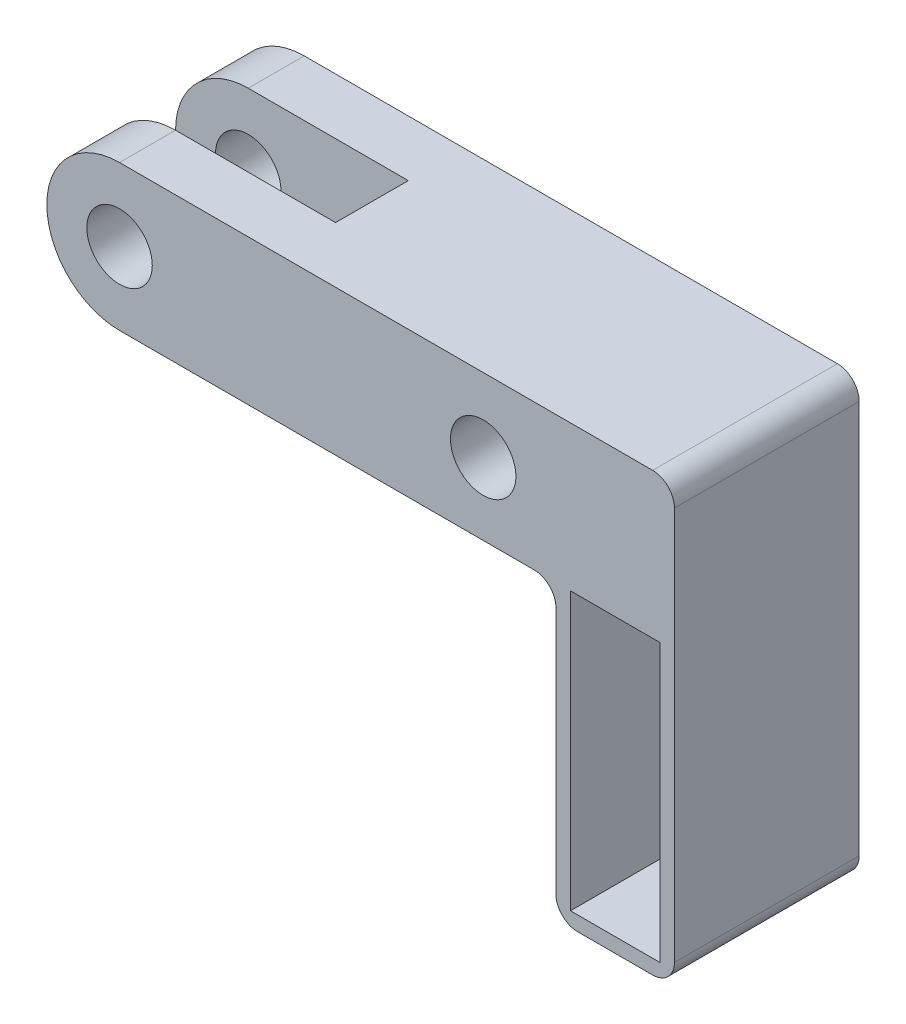
ISO-10303-21;
HEADER;
FILE_DESCRIPTION(('STEP AP214'),'2;1');
FILE_NAME('part.step','',(''),(''),'','','');
FILE_SCHEMA(('AUTOMOTIVE_DESIGN { 1 0 10303 214 1 1 1 1 }'));
ENDSEC;
DATA;
#1=APPLICATION_CONTEXT('core data for automotive mechanical design processes');
#2=APPLICATION_PROTOCOL_DEFINITION('international standard','automotive_design',2000,#1);
#3=PRODUCT_CONTEXT('',#1,'mechanical');
#4=PRODUCT('Part','Part','',(#3));
#5=PRODUCT_RELATED_PRODUCT_CATEGORY('part','',(#4));
#6=PRODUCT_DEFINITION_FORMATION('','',#4);
#7=PRODUCT_DEFINITION_CONTEXT('part definition',#1,'design');
#8=PRODUCT_DEFINITION('design','',#6,#7);
#9=PRODUCT_DEFINITION_SHAPE('','',#8);
#10=(LENGTH_UNIT() NAMED_UNIT(*) SI_UNIT(.MILLI.,.METRE.));
#11=(NAMED_UNIT(*) PLANE_ANGLE_UNIT() SI_UNIT($,.RADIAN.));
#12=(NAMED_UNIT(*) SI_UNIT($,.STERADIAN.) SOLID_ANGLE_UNIT());
#13=UNCERTAINTY_MEASURE_WITH_UNIT(LENGTH_MEASURE(1.E-05),#10,'distance_accuracy_value','');
#14=(GEOMETRIC_REPRESENTATION_CONTEXT(3) GLOBAL_UNCERTAINTY_ASSIGNED_CONTEXT((#13)) GLOBAL_UNIT_ASSIGNED_CONTEXT((#10,
#11,#12)) REPRESENTATION_CONTEXT('',''));
#15=CARTESIAN_POINT('',(0.,0.,0.));
#16=DIRECTION('',(0.,0.,1.));
#17=DIRECTION('',(1.,0.,0.));
#18=AXIS2_PLACEMENT_3D('',#15,#16,#17);
#19=CARTESIAN_POINT('',(0.,0.,6.35));
#20=DIRECTION('',(0.,0.,-1.));
#21=DIRECTION('',(-1.,0.,0.));
#22=AXIS2_PLACEMENT_3D('',#19,#20,#21);
#23=CYLINDRICAL_SURFACE('',#22,5.);
#24=DIRECTION('',(0.,0.,-1.));
#25=VECTOR('',#24,1.);
#26=CARTESIAN_POINT('',(0.,5.,6.35));
#27=LINE('',#26,#25);
#28=CARTESIAN_POINT('',(0.,5.,6.35));
#29=VERTEX_POINT('',#28);
#30=CARTESIAN_POINT('',(0.,5.,2.5));
#31=VERTEX_POINT('',#30);
#32=EDGE_CURVE('E282',#29,#31,#27,.T.);
#33=ORIENTED_EDGE('',*,*,#32,.T.);
#34=CARTESIAN_POINT('',(0.,0.,2.5));
#35=DIRECTION('',(0.,0.,1.));
#36=DIRECTION('',(1.,0.,0.));
#37=AXIS2_PLACEMENT_3D('',#34,#35,#36);
#38=CIRCLE('',#37,5.);
#39=CARTESIAN_POINT('',(0.,-5.,2.5));
#40=VERTEX_POINT('',#39);
#41=EDGE_CURVE('E207',#31,#40,#38,.T.);
#42=ORIENTED_EDGE('',*,*,#41,.T.);
#43=DIRECTION('',(0.,0.,-1.));
#44=VECTOR('',#43,1.);
#45=CARTESIAN_POINT('',(0.,-5.,6.35));
#46=LINE('',#45,#44);
#47=CARTESIAN_POINT('',(0.,-5.,6.35));
#48=VERTEX_POINT('',#47);
#49=EDGE_CURVE('E278',#48,#40,#46,.T.);
#50=ORIENTED_EDGE('',*,*,#49,.F.);
#51=CARTESIAN_POINT('',(0.,0.,6.35));
#52=DIRECTION('',(0.,0.,1.));
#53=DIRECTION('',(1.,0.,0.));
#54=AXIS2_PLACEMENT_3D('',#51,#52,#53);
#55=CIRCLE('',#54,5.);
#56=EDGE_CURVE('E230',#29,#48,#55,.T.);
#57=ORIENTED_EDGE('',*,*,#56,.F.);
#58=EDGE_LOOP('',(#33,#42,#50,#57));
#59=FACE_BOUND('',#58,.T.);
#60=ADVANCED_FACE('F43',(#59),#23,.T.);
#61=CARTESIAN_POINT('',(0.,0.,6.35));
#62=DIRECTION('',(0.,0.,-1.));
#63=DIRECTION('',(-1.,0.,0.));
#64=AXIS2_PLACEMENT_3D('',#61,#62,#63);
#65=CYLINDRICAL_SURFACE('',#64,2.24999999997106);
#66=CARTESIAN_POINT('',(0.,0.,2.5));
#67=DIRECTION('',(0.,0.,1.));
#68=DIRECTION('',(1.,0.,0.));
#69=AXIS2_PLACEMENT_3D('',#66,#67,#68);
#70=CIRCLE('',#69,2.24999999997106);
#71=CARTESIAN_POINT('',(2.24999999997106,0.,2.5));
#72=VERTEX_POINT('',#71);
#73=EDGE_CURVE('E206',#72,#72,#70,.T.);
#74=ORIENTED_EDGE('',*,*,#73,.F.);
#75=EDGE_LOOP('',(#74));
#76=FACE_BOUND('',#75,.T.);
#77=CARTESIAN_POINT('',(0.,0.,6.35));
#78=DIRECTION('',(0.,0.,1.));
#79=DIRECTION('',(1.,0.,0.));
#80=AXIS2_PLACEMENT_3D('',#77,#78,#79);
#81=CIRCLE('',#80,2.24999999997106);
#82=CARTESIAN_POINT('',(2.24999999997106,0.,6.35));
#83=VERTEX_POINT('',#82);
#84=EDGE_CURVE('E213',#83,#83,#81,.T.);
#85=ORIENTED_EDGE('',*,*,#84,.T.);
#86=EDGE_LOOP('',(#85));
#87=FACE_BOUND('',#86,.T.);
#88=ADVANCED_FACE('F371',(#76,#87),#65,.F.);
#89=CARTESIAN_POINT('',(0.,5.,6.35));
#90=DIRECTION('',(0.,1.,0.));
#91=DIRECTION('',(0.,0.,1.));
#92=AXIS2_PLACEMENT_3D('',#89,#90,#91);
#93=PLANE('',#92);
#94=DIRECTION('',(1.,0.,0.));
#95=VECTOR('',#94,1.);
#96=CARTESIAN_POINT('',(0.,5.,6.35));
#97=LINE('',#96,#95);
#98=CARTESIAN_POINT('',(36.65,5.,6.35));
#99=VERTEX_POINT('',#98);
#100=EDGE_CURVE('E228',#29,#99,#97,.T.);
#101=ORIENTED_EDGE('',*,*,#100,.T.);
#102=DIRECTION('',(0.,0.,-1.));
#103=VECTOR('',#102,1.);
#104=CARTESIAN_POINT('',(36.65,5.,6.35));
#105=LINE('',#104,#103);
#106=CARTESIAN_POINT('',(36.65,5.,-6.35));
#107=VERTEX_POINT('',#106);
#108=EDGE_CURVE('E306',#99,#107,#105,.T.);
#109=ORIENTED_EDGE('',*,*,#108,.T.);
#110=DIRECTION('',(1.,0.,0.));
#111=VECTOR('',#110,1.);
#112=CARTESIAN_POINT('',(0.,5.,-6.35));
#113=LINE('',#112,#111);
#114=CARTESIAN_POINT('',(0.,5.,-6.35));
#115=VERTEX_POINT('',#114);
#116=EDGE_CURVE('E261',#115,#107,#113,.T.);
#117=ORIENTED_EDGE('',*,*,#116,.F.);
#118=CARTESIAN_POINT('',(0.,5.,-2.5));
#119=VERTEX_POINT('',#118);
#120=EDGE_CURVE('E190',#119,#115,#27,.T.);
#121=ORIENTED_EDGE('',*,*,#120,.F.);
#122=DIRECTION('',(1.,0.,0.));
#123=VECTOR('',#122,1.);
#124=CARTESIAN_POINT('',(-5.,5.,-2.5));
#125=LINE('',#124,#123);
#126=CARTESIAN_POINT('',(11.,5.,-2.5));
#127=VERTEX_POINT('',#126);
#128=EDGE_CURVE('E172',#119,#127,#125,.T.);
#129=ORIENTED_EDGE('',*,*,#128,.T.);
#130=DIRECTION('',(0.,0.,1.));
#131=VECTOR('',#130,1.);
#132=CARTESIAN_POINT('',(11.,5.,-2.5));
#133=LINE('',#132,#131);
#134=CARTESIAN_POINT('',(11.,5.,2.5));
#135=VERTEX_POINT('',#134);
#136=EDGE_CURVE('E188',#127,#135,#133,.T.);
#137=ORIENTED_EDGE('',*,*,#136,.T.);
#138=DIRECTION('',(-1.,0.,0.));
#139=VECTOR('',#138,1.);
#140=CARTESIAN_POINT('',(-5.,5.,2.5));
#141=LINE('',#140,#139);
#142=EDGE_CURVE('E196',#135,#31,#141,.T.);
#143=ORIENTED_EDGE('',*,*,#142,.T.);
#144=ORIENTED_EDGE('',*,*,#32,.F.);
#145=EDGE_LOOP('',(#101,#109,#117,#121,#129,#137,#143,#144));
#146=FACE_BOUND('',#145,.T.);
#147=ADVANCED_FACE('F186',(#146),#93,.T.);
#148=CARTESIAN_POINT('',(0.,0.,-2.5));
#149=DIRECTION('',(0.,0.,-1.));
#150=DIRECTION('',(-1.,0.,0.));
#151=AXIS2_PLACEMENT_3D('',#148,#149,#150);
#152=CIRCLE('',#151,5.);
#153=CARTESIAN_POINT('',(0.,-5.,-2.5));
#154=VERTEX_POINT('',#153);
#155=EDGE_CURVE('E204',#154,#119,#152,.T.);
#156=ORIENTED_EDGE('',*,*,#155,.T.);
#157=ORIENTED_EDGE('',*,*,#120,.T.);
#158=CARTESIAN_POINT('',(0.,0.,-6.35));
#159=DIRECTION('',(0.,0.,1.));
#160=DIRECTION('',(1.,0.,0.));
#161=AXIS2_PLACEMENT_3D('',#158,#159,#160);
#162=CIRCLE('',#161,5.);
#163=CARTESIAN_POINT('',(0.,-5.,-6.35));
#164=VERTEX_POINT('',#163);
#165=EDGE_CURVE('E264',#115,#164,#162,.T.);
#166=ORIENTED_EDGE('',*,*,#165,.T.);
#167=EDGE_CURVE('E281',#154,#164,#46,.T.);
#168=ORIENTED_EDGE('',*,*,#167,.F.);
#169=EDGE_LOOP('',(#156,#157,#166,#168));
#170=FACE_BOUND('',#169,.T.);
#171=ADVANCED_FACE('F364',(#170),#23,.T.);
#172=CARTESIAN_POINT('',(0.,-5.,6.35));
#173=DIRECTION('',(0.,1.,0.));
#174=DIRECTION('',(0.,0.,1.));
#175=AXIS2_PLACEMENT_3D('',#172,#173,#174);
#176=PLANE('',#175);
#177=DIRECTION('',(1.,0.,0.));
#178=VECTOR('',#177,1.);
#179=CARTESIAN_POINT('',(0.,-5.,-6.35));
#180=LINE('',#179,#178);
#181=CARTESIAN_POINT('',(28.5,-5.,-6.35));
#182=VERTEX_POINT('',#181);
#183=EDGE_CURVE('E267',#164,#182,#180,.T.);
#184=ORIENTED_EDGE('',*,*,#183,.T.);
#185=DIRECTION('',(0.,0.,-1.));
#186=VECTOR('',#185,1.);
#187=CARTESIAN_POINT('',(28.5,-5.,6.35));
#188=LINE('',#187,#186);
#189=CARTESIAN_POINT('',(28.5,-5.,6.35));
#190=VERTEX_POINT('',#189);
#191=EDGE_CURVE('E304',#182,#190,#188,.F.);
#192=ORIENTED_EDGE('',*,*,#191,.T.);
#193=DIRECTION('',(1.,0.,0.));
#194=VECTOR('',#193,1.);
#195=CARTESIAN_POINT('',(0.,-5.,6.35));
#196=LINE('',#195,#194);
#197=EDGE_CURVE('E233',#48,#190,#196,.T.);
#198=ORIENTED_EDGE('',*,*,#197,.F.);
#199=ORIENTED_EDGE('',*,*,#49,.T.);
#200=DIRECTION('',(-1.,0.,0.));
#201=VECTOR('',#200,1.);
#202=CARTESIAN_POINT('',(-5.,-5.,2.5));
#203=LINE('',#202,#201);
#204=CARTESIAN_POINT('',(19.,-5.,2.5));
#205=VERTEX_POINT('',#204);
#206=EDGE_CURVE('E191',#205,#40,#203,.T.);
#207=ORIENTED_EDGE('',*,*,#206,.F.);
#208=DIRECTION('',(0.,0.,-1.));
#209=VECTOR('',#208,1.);
#210=CARTESIAN_POINT('',(19.,-5.,6.35));
#211=LINE('',#210,#209);
#212=CARTESIAN_POINT('',(19.,-5.,-2.5));
#213=VERTEX_POINT('',#212);
#214=EDGE_CURVE('E285',#205,#213,#211,.T.);
#215=ORIENTED_EDGE('',*,*,#214,.T.);
#216=DIRECTION('',(1.,0.,0.));
#217=VECTOR('',#216,1.);
#218=CARTESIAN_POINT('',(-5.,-5.,-2.5));
#219=LINE('',#218,#217);
#220=EDGE_CURVE('E175',#154,#213,#219,.T.);
#221=ORIENTED_EDGE('',*,*,#220,.F.);
#222=ORIENTED_EDGE('',*,*,#167,.T.);
#223=EDGE_LOOP('',(#184,#192,#198,#199,#207,#215,#221,#222));
#224=FACE_BOUND('',#223,.T.);
#225=ADVANCED_FACE('F337',(#224),#176,.F.);
#226=CARTESIAN_POINT('',(30.,0.,6.35));
#227=DIRECTION('',(1.,0.,0.));
#228=DIRECTION('',(0.,0.,-1.));
#229=AXIS2_PLACEMENT_3D('',#226,#227,#228);
#230=PLANE('',#229);
#231=DIRECTION('',(0.,-1.,0.));
#232=VECTOR('',#231,1.);
#233=CARTESIAN_POINT('',(30.,0.,6.35));
#234=LINE('',#233,#232);
#235=CARTESIAN_POINT('',(30.,-6.5,6.35));
#236=VERTEX_POINT('',#235);
#237=CARTESIAN_POINT('',(30.,-23.55,6.35));
#238=VERTEX_POINT('',#237);
#239=EDGE_CURVE('E236',#236,#238,#234,.T.);
#240=ORIENTED_EDGE('',*,*,#239,.F.);
#241=DIRECTION('',(0.,0.,-1.));
#242=VECTOR('',#241,1.);
#243=CARTESIAN_POINT('',(30.,-6.5,-6.35));
#244=LINE('',#243,#242);
#245=CARTESIAN_POINT('',(30.,-6.5,-6.35));
#246=VERTEX_POINT('',#245);
#247=EDGE_CURVE('E301',#236,#246,#244,.T.);
#248=ORIENTED_EDGE('',*,*,#247,.T.);
#249=DIRECTION('',(0.,-1.,0.));
#250=VECTOR('',#249,1.);
#251=CARTESIAN_POINT('',(30.,0.,-6.35));
#252=LINE('',#251,#250);
#253=CARTESIAN_POINT('',(30.,-23.55,-6.35));
#254=VERTEX_POINT('',#253);
#255=EDGE_CURVE('E270',#246,#254,#252,.T.);
#256=ORIENTED_EDGE('',*,*,#255,.T.);
#257=DIRECTION('',(0.,0.,-1.));
#258=VECTOR('',#257,1.);
#259=CARTESIAN_POINT('',(30.,-23.55,6.35));
#260=LINE('',#259,#258);
#261=EDGE_CURVE('E180',#254,#238,#260,.F.);
#262=ORIENTED_EDGE('',*,*,#261,.T.);
#263=EDGE_LOOP('',(#240,#248,#256,#262));
#264=FACE_BOUND('',#263,.T.);
#265=ADVANCED_FACE('F345',(#264),#230,.F.);
#266=CARTESIAN_POINT('',(0.,-25.05,6.35));
#267=DIRECTION('',(0.,-1.,0.));
#268=DIRECTION('',(0.,0.,-1.));
#269=AXIS2_PLACEMENT_3D('',#266,#267,#268);
#270=PLANE('',#269);
#271=DIRECTION('',(-1.,0.,0.));
#272=VECTOR('',#271,1.);
#273=CARTESIAN_POINT('',(0.,-25.05,-6.35));
#274=LINE('',#273,#272);
#275=CARTESIAN_POINT('',(36.65,-25.05,-6.35));
#276=VERTEX_POINT('',#275);
#277=CARTESIAN_POINT('',(31.5,-25.05,-6.35));
#278=VERTEX_POINT('',#277);
#279=EDGE_CURVE('E273',#276,#278,#274,.T.);
#280=ORIENTED_EDGE('',*,*,#279,.F.);
#281=DIRECTION('',(0.,0.,-1.));
#282=VECTOR('',#281,1.);
#283=CARTESIAN_POINT('',(36.65,-25.05,6.35));
#284=LINE('',#283,#282);
#285=CARTESIAN_POINT('',(36.65,-25.05,6.35));
#286=VERTEX_POINT('',#285);
#287=EDGE_CURVE('E65',#276,#286,#284,.F.);
#288=ORIENTED_EDGE('',*,*,#287,.T.);
#289=DIRECTION('',(-1.,0.,0.));
#290=VECTOR('',#289,1.);
#291=CARTESIAN_POINT('',(0.,-25.05,6.35));
#292=LINE('',#291,#290);
#293=CARTESIAN_POINT('',(31.5,-25.05,6.35));
#294=VERTEX_POINT('',#293);
#295=EDGE_CURVE('E238',#286,#294,#292,.T.);
#296=ORIENTED_EDGE('',*,*,#295,.T.);
#297=DIRECTION('',(0.,0.,-1.));
#298=VECTOR('',#297,1.);
#299=CARTESIAN_POINT('',(31.5,-25.05,-6.35));
#300=LINE('',#299,#298);
#301=EDGE_CURVE('E325',#294,#278,#300,.T.);
#302=ORIENTED_EDGE('',*,*,#301,.T.);
#303=EDGE_LOOP('',(#280,#288,#296,#302));
#304=FACE_BOUND('',#303,.T.);
#305=ADVANCED_FACE('F349',(#304),#270,.T.);
#306=CARTESIAN_POINT('',(37.15,0.,6.35));
#307=DIRECTION('',(-1.,0.,0.));
#308=DIRECTION('',(0.,0.,1.));
#309=AXIS2_PLACEMENT_3D('',#306,#307,#308);
#310=PLANE('',#309);
#311=DIRECTION('',(0.,1.,0.));
#312=VECTOR('',#311,1.);
#313=CARTESIAN_POINT('',(37.15,0.,-6.35));
#314=LINE('',#313,#312);
#315=CARTESIAN_POINT('',(37.15,-24.05,-6.35));
#316=VERTEX_POINT('',#315);
#317=CARTESIAN_POINT('',(37.15,-5.,-6.35));
#318=VERTEX_POINT('',#317);
#319=EDGE_CURVE('E249',#316,#318,#314,.T.);
#320=ORIENTED_EDGE('',*,*,#319,.F.);
#321=DIRECTION('',(0.,0.,-1.));
#322=VECTOR('',#321,1.);
#323=CARTESIAN_POINT('',(37.15,-24.05,6.35));
#324=LINE('',#323,#322);
#325=CARTESIAN_POINT('',(37.15,-24.05,6.35));
#326=VERTEX_POINT('',#325);
#327=EDGE_CURVE('E292',#326,#316,#324,.T.);
#328=ORIENTED_EDGE('',*,*,#327,.F.);
#329=DIRECTION('',(0.,1.,0.));
#330=VECTOR('',#329,1.);
#331=CARTESIAN_POINT('',(37.15,0.,6.35));
#332=LINE('',#331,#330);
#333=CARTESIAN_POINT('',(37.15,-5.,6.35));
#334=VERTEX_POINT('',#333);
#335=EDGE_CURVE('E217',#326,#334,#332,.T.);
#336=ORIENTED_EDGE('',*,*,#335,.T.);
#337=DIRECTION('',(0.,0.,-1.));
#338=VECTOR('',#337,1.);
#339=CARTESIAN_POINT('',(37.15,-5.,6.35));
#340=LINE('',#339,#338);
#341=EDGE_CURVE('E243',#334,#318,#340,.T.);
#342=ORIENTED_EDGE('',*,*,#341,.T.);
#343=EDGE_LOOP('',(#320,#328,#336,#342));
#344=FACE_BOUND('',#343,.T.);
#345=ADVANCED_FACE('F403',(#344),#310,.T.);
#346=CARTESIAN_POINT('',(0.,-24.05,6.35));
#347=DIRECTION('',(0.,1.,0.));
#348=DIRECTION('',(0.,0.,1.));
#349=AXIS2_PLACEMENT_3D('',#346,#347,#348);
#350=PLANE('',#349);
#351=DIRECTION('',(1.,0.,0.));
#352=VECTOR('',#351,1.);
#353=CARTESIAN_POINT('',(0.,-24.05,-6.35));
#354=LINE('',#353,#352);
#355=CARTESIAN_POINT('',(31.,-24.05,-6.35));
#356=VERTEX_POINT('',#355);
#357=EDGE_CURVE('E252',#356,#316,#354,.T.);
#358=ORIENTED_EDGE('',*,*,#357,.F.);
#359=DIRECTION('',(0.,0.,-1.));
#360=VECTOR('',#359,1.);
#361=CARTESIAN_POINT('',(31.,-24.05,6.35));
#362=LINE('',#361,#360);
#363=CARTESIAN_POINT('',(31.,-24.05,6.35));
#364=VERTEX_POINT('',#363);
#365=EDGE_CURVE('E290',#364,#356,#362,.T.);
#366=ORIENTED_EDGE('',*,*,#365,.F.);
#367=DIRECTION('',(1.,0.,0.));
#368=VECTOR('',#367,1.);
#369=CARTESIAN_POINT('',(0.,-24.05,6.35));
#370=LINE('',#369,#368);
#371=EDGE_CURVE('E220',#364,#326,#370,.T.);
#372=ORIENTED_EDGE('',*,*,#371,.T.);
#373=ORIENTED_EDGE('',*,*,#327,.T.);
#374=EDGE_LOOP('',(#358,#366,#372,#373));
#375=FACE_BOUND('',#374,.T.);
#376=ADVANCED_FACE('F399',(#375),#350,.T.);
#377=CARTESIAN_POINT('',(31.,0.,6.35));
#378=DIRECTION('',(-1.,0.,0.));
#379=DIRECTION('',(0.,0.,1.));
#380=AXIS2_PLACEMENT_3D('',#377,#378,#379);
#381=PLANE('',#380);
#382=DIRECTION('',(0.,1.,0.));
#383=VECTOR('',#382,1.);
#384=CARTESIAN_POINT('',(31.,0.,-6.35));
#385=LINE('',#384,#383);
#386=CARTESIAN_POINT('',(31.,-5.,-6.35));
#387=VERTEX_POINT('',#386);
#388=EDGE_CURVE('E255',#356,#387,#385,.T.);
#389=ORIENTED_EDGE('',*,*,#388,.T.);
#390=DIRECTION('',(0.,0.,-1.));
#391=VECTOR('',#390,1.);
#392=CARTESIAN_POINT('',(31.,-5.,6.35));
#393=LINE('',#392,#391);
#394=CARTESIAN_POINT('',(31.,-5.,6.35));
#395=VERTEX_POINT('',#394);
#396=EDGE_CURVE('E287',#395,#387,#393,.T.);
#397=ORIENTED_EDGE('',*,*,#396,.F.);
#398=DIRECTION('',(0.,1.,0.));
#399=VECTOR('',#398,1.);
#400=CARTESIAN_POINT('',(31.,0.,6.35));
#401=LINE('',#400,#399);
#402=EDGE_CURVE('E223',#364,#395,#401,.T.);
#403=ORIENTED_EDGE('',*,*,#402,.F.);
#404=ORIENTED_EDGE('',*,*,#365,.T.);
#405=EDGE_LOOP('',(#389,#397,#403,#404));
#406=FACE_BOUND('',#405,.T.);
#407=ADVANCED_FACE('F395',(#406),#381,.F.);
#408=CARTESIAN_POINT('',(0.,-5.,6.35));
#409=DIRECTION('',(0.,1.,0.));
#410=DIRECTION('',(0.,0.,1.));
#411=AXIS2_PLACEMENT_3D('',#408,#409,#410);
#412=PLANE('',#411);
#413=DIRECTION('',(1.,0.,0.));
#414=VECTOR('',#413,1.);
#415=CARTESIAN_POINT('',(0.,-5.,-6.35));
#416=LINE('',#415,#414);
#417=EDGE_CURVE('E258',#387,#318,#416,.T.);
#418=ORIENTED_EDGE('',*,*,#417,.T.);
#419=ORIENTED_EDGE('',*,*,#341,.F.);
#420=DIRECTION('',(1.,0.,0.));
#421=VECTOR('',#420,1.);
#422=CARTESIAN_POINT('',(0.,-5.,6.35));
#423=LINE('',#422,#421);
#424=EDGE_CURVE('E226',#395,#334,#423,.T.);
#425=ORIENTED_EDGE('',*,*,#424,.F.);
#426=ORIENTED_EDGE('',*,*,#396,.T.);
#427=EDGE_LOOP('',(#418,#419,#425,#426));
#428=FACE_BOUND('',#427,.T.);
#429=ADVANCED_FACE('F392',(#428),#412,.F.);
#430=CARTESIAN_POINT('',(0.,0.,-2.5));
#431=DIRECTION('',(0.,0.,-1.));
#432=DIRECTION('',(-1.,0.,0.));
#433=AXIS2_PLACEMENT_3D('',#430,#431,#432);
#434=CIRCLE('',#433,2.24999999997106);
#435=CARTESIAN_POINT('',(-2.24999999997106,0.,-2.5));
#436=VERTEX_POINT('',#435);
#437=EDGE_CURVE('E198',#436,#436,#434,.T.);
#438=ORIENTED_EDGE('',*,*,#437,.F.);
#439=EDGE_LOOP('',(#438));
#440=FACE_BOUND('',#439,.T.);
#441=CARTESIAN_POINT('',(0.,0.,-6.35));
#442=DIRECTION('',(0.,0.,1.));
#443=DIRECTION('',(1.,0.,0.));
#444=AXIS2_PLACEMENT_3D('',#441,#442,#443);
#445=CIRCLE('',#444,2.24999999997106);
#446=CARTESIAN_POINT('',(2.24999999997106,0.,-6.35));
#447=VERTEX_POINT('',#446);
#448=EDGE_CURVE('E246',#447,#447,#445,.T.);
#449=ORIENTED_EDGE('',*,*,#448,.F.);
#450=EDGE_LOOP('',(#449));
#451=FACE_BOUND('',#450,.T.);
#452=ADVANCED_FACE('F379',(#440,#451),#65,.F.);
#453=CARTESIAN_POINT('',(25.,-0.0667958273800617,6.35));
#454=DIRECTION('',(0.,0.,-1.));
#455=DIRECTION('',(-1.,0.,0.));
#456=AXIS2_PLACEMENT_3D('',#453,#454,#455);
#457=CYLINDRICAL_SURFACE('',#456,2.25);
#458=CARTESIAN_POINT('',(25.,-0.0667958273800617,6.35));
#459=DIRECTION('',(0.,0.,1.));
#460=DIRECTION('',(1.,0.,0.));
#461=AXIS2_PLACEMENT_3D('',#458,#459,#460);
#462=CIRCLE('',#461,2.25);
#463=CARTESIAN_POINT('',(27.25,-0.0667958273800617,6.35));
#464=VERTEX_POINT('',#463);
#465=EDGE_CURVE('E210',#464,#464,#462,.T.);
#466=ORIENTED_EDGE('',*,*,#465,.T.);
#467=EDGE_LOOP('',(#466));
#468=FACE_BOUND('',#467,.T.);
#469=CARTESIAN_POINT('',(25.,-0.0667958273800617,-6.35));
#470=DIRECTION('',(0.,0.,1.));
#471=DIRECTION('',(1.,0.,0.));
#472=AXIS2_PLACEMENT_3D('',#469,#470,#471);
#473=CIRCLE('',#472,2.25);
#474=CARTESIAN_POINT('',(27.25,-0.0667958273800617,-6.35));
#475=VERTEX_POINT('',#474);
#476=EDGE_CURVE('E209',#475,#475,#473,.T.);
#477=ORIENTED_EDGE('',*,*,#476,.F.);
#478=EDGE_LOOP('',(#477));
#479=FACE_BOUND('',#478,.T.);
#480=ADVANCED_FACE('F408',(#468,#479),#457,.F.);
#481=CARTESIAN_POINT('',(38.15,0.,6.35));
#482=DIRECTION('',(1.,0.,0.));
#483=DIRECTION('',(0.,1.,0.));
#484=AXIS2_PLACEMENT_3D('',#481,#482,#483);
#485=PLANE('',#484);
#486=DIRECTION('',(0.,-1.,0.));
#487=VECTOR('',#486,1.);
#488=CARTESIAN_POINT('',(38.15,0.,-6.35));
#489=LINE('',#488,#487);
#490=CARTESIAN_POINT('',(38.15,3.5,-6.35));
#491=VERTEX_POINT('',#490);
#492=CARTESIAN_POINT('',(38.15,-23.55,-6.35));
#493=VERTEX_POINT('',#492);
#494=EDGE_CURVE('E214',#491,#493,#489,.T.);
#495=ORIENTED_EDGE('',*,*,#494,.F.);
#496=DIRECTION('',(0.,0.,-1.));
#497=VECTOR('',#496,1.);
#498=CARTESIAN_POINT('',(38.15,3.5,6.35));
#499=LINE('',#498,#497);
#500=CARTESIAN_POINT('',(38.15,3.5,6.35));
#501=VERTEX_POINT('',#500);
#502=EDGE_CURVE('E318',#491,#501,#499,.F.);
#503=ORIENTED_EDGE('',*,*,#502,.T.);
#504=DIRECTION('',(0.,-1.,0.));
#505=VECTOR('',#504,1.);
#506=CARTESIAN_POINT('',(38.15,0.,6.35));
#507=LINE('',#506,#505);
#508=CARTESIAN_POINT('',(38.15,-23.55,6.35));
#509=VERTEX_POINT('',#508);
#510=EDGE_CURVE('E240',#501,#509,#507,.T.);
#511=ORIENTED_EDGE('',*,*,#510,.T.);
#512=DIRECTION('',(0.,0.,-1.));
#513=VECTOR('',#512,1.);
#514=CARTESIAN_POINT('',(38.15,-23.55,6.35));
#515=LINE('',#514,#513);
#516=EDGE_CURVE('E315',#509,#493,#515,.T.);
#517=ORIENTED_EDGE('',*,*,#516,.T.);
#518=EDGE_LOOP('',(#495,#503,#511,#517));
#519=FACE_BOUND('',#518,.T.);
#520=ADVANCED_FACE('F356',(#519),#485,.T.);
#521=CARTESIAN_POINT('',(0.,0.,6.35));
#522=DIRECTION('',(0.,0.,1.));
#523=DIRECTION('',(1.,0.,0.));
#524=AXIS2_PLACEMENT_3D('',#521,#522,#523);
#525=PLANE('',#524);
#526=ORIENTED_EDGE('',*,*,#465,.F.);
#527=EDGE_LOOP('',(#526));
#528=FACE_BOUND('',#527,.T.);
#529=ORIENTED_EDGE('',*,*,#84,.F.);
#530=EDGE_LOOP('',(#529));
#531=FACE_BOUND('',#530,.T.);
#532=ORIENTED_EDGE('',*,*,#335,.F.);
#533=ORIENTED_EDGE('',*,*,#371,.F.);
#534=ORIENTED_EDGE('',*,*,#402,.T.);
#535=ORIENTED_EDGE('',*,*,#424,.T.);
#536=EDGE_LOOP('',(#532,#533,#534,#535));
#537=FACE_BOUND('',#536,.T.);
#538=ORIENTED_EDGE('',*,*,#510,.F.);
#539=CARTESIAN_POINT('',(36.65,3.5,6.35));
#540=DIRECTION('',(0.,0.,1.));
#541=DIRECTION('',(1.,0.,0.));
#542=AXIS2_PLACEMENT_3D('',#539,#540,#541);
#543=CIRCLE('',#542,1.5);
#544=EDGE_CURVE('E323',#501,#99,#543,.T.);
#545=ORIENTED_EDGE('',*,*,#544,.T.);
#546=ORIENTED_EDGE('',*,*,#100,.F.);
#547=ORIENTED_EDGE('',*,*,#56,.T.);
#548=ORIENTED_EDGE('',*,*,#197,.T.);
#549=CARTESIAN_POINT('',(28.5,-6.5,6.35));
#550=DIRECTION('',(0.,0.,1.));
#551=DIRECTION('',(1.,0.,0.));
#552=AXIS2_PLACEMENT_3D('',#549,#550,#551);
#553=CIRCLE('',#552,1.5);
#554=EDGE_CURVE('E11',#190,#236,#553,.F.);
#555=ORIENTED_EDGE('',*,*,#554,.T.);
#556=ORIENTED_EDGE('',*,*,#239,.T.);
#557=CARTESIAN_POINT('',(31.5,-23.55,6.35));
#558=DIRECTION('',(0.,0.,1.));
#559=DIRECTION('',(1.,0.,0.));
#560=AXIS2_PLACEMENT_3D('',#557,#558,#559);
#561=CIRCLE('',#560,1.5);
#562=EDGE_CURVE('E58',#238,#294,#561,.T.);
#563=ORIENTED_EDGE('',*,*,#562,.T.);
#564=ORIENTED_EDGE('',*,*,#295,.F.);
#565=CARTESIAN_POINT('',(36.65,-23.55,6.35));
#566=DIRECTION('',(0.,0.,1.));
#567=DIRECTION('',(1.,0.,0.));
#568=AXIS2_PLACEMENT_3D('',#565,#566,#567);
#569=CIRCLE('',#568,1.5);
#570=EDGE_CURVE('E321',#286,#509,#569,.T.);
#571=ORIENTED_EDGE('',*,*,#570,.T.);
#572=EDGE_LOOP('',(#538,#545,#546,#547,#548,#555,#556,#563,#564,#571));
#573=FACE_BOUND('',#572,.T.);
#574=ADVANCED_FACE('F343',(#528,#531,#537,#573),#525,.T.);
#575=CARTESIAN_POINT('',(0.,0.,-6.35));
#576=DIRECTION('',(0.,0.,1.));
#577=DIRECTION('',(1.,0.,0.));
#578=AXIS2_PLACEMENT_3D('',#575,#576,#577);
#579=PLANE('',#578);
#580=ORIENTED_EDGE('',*,*,#476,.T.);
#581=EDGE_LOOP('',(#580));
#582=FACE_BOUND('',#581,.T.);
#583=ORIENTED_EDGE('',*,*,#448,.T.);
#584=EDGE_LOOP('',(#583));
#585=FACE_BOUND('',#584,.T.);
#586=ORIENTED_EDGE('',*,*,#319,.T.);
#587=ORIENTED_EDGE('',*,*,#417,.F.);
#588=ORIENTED_EDGE('',*,*,#388,.F.);
#589=ORIENTED_EDGE('',*,*,#357,.T.);
#590=EDGE_LOOP('',(#586,#587,#588,#589));
#591=FACE_BOUND('',#590,.T.);
#592=ORIENTED_EDGE('',*,*,#116,.T.);
#593=CARTESIAN_POINT('',(36.65,3.5,-6.35));
#594=DIRECTION('',(0.,0.,1.));
#595=DIRECTION('',(1.,0.,0.));
#596=AXIS2_PLACEMENT_3D('',#593,#594,#595);
#597=CIRCLE('',#596,1.5);
#598=EDGE_CURVE('E313',#107,#491,#597,.F.);
#599=ORIENTED_EDGE('',*,*,#598,.T.);
#600=ORIENTED_EDGE('',*,*,#494,.T.);
#601=CARTESIAN_POINT('',(36.65,-23.55,-6.35));
#602=DIRECTION('',(0.,0.,1.));
#603=DIRECTION('',(1.,0.,0.));
#604=AXIS2_PLACEMENT_3D('',#601,#602,#603);
#605=CIRCLE('',#604,1.5);
#606=EDGE_CURVE('E311',#493,#276,#605,.F.);
#607=ORIENTED_EDGE('',*,*,#606,.T.);
#608=ORIENTED_EDGE('',*,*,#279,.T.);
#609=CARTESIAN_POINT('',(31.5,-23.55,-6.35));
#610=DIRECTION('',(0.,0.,1.));
#611=DIRECTION('',(1.,0.,0.));
#612=AXIS2_PLACEMENT_3D('',#609,#610,#611);
#613=CIRCLE('',#612,1.5);
#614=EDGE_CURVE('E309',#278,#254,#613,.F.);
#615=ORIENTED_EDGE('',*,*,#614,.T.);
#616=ORIENTED_EDGE('',*,*,#255,.F.);
#617=CARTESIAN_POINT('',(28.5,-6.5,-6.35));
#618=DIRECTION('',(0.,0.,1.));
#619=DIRECTION('',(1.,0.,0.));
#620=AXIS2_PLACEMENT_3D('',#617,#618,#619);
#621=CIRCLE('',#620,1.5);
#622=EDGE_CURVE('E51',#246,#182,#621,.T.);
#623=ORIENTED_EDGE('',*,*,#622,.T.);
#624=ORIENTED_EDGE('',*,*,#183,.F.);
#625=ORIENTED_EDGE('',*,*,#165,.F.);
#626=EDGE_LOOP('',(#592,#599,#600,#607,#608,#615,#616,#623,#624,#625));
#627=FACE_BOUND('',#626,.T.);
#628=ADVANCED_FACE('F331',(#582,#585,#591,#627),#579,.F.);
#629=CARTESIAN_POINT('',(-5.,5.,2.5));
#630=DIRECTION('',(0.,0.,1.));
#631=DIRECTION('',(1.,0.,0.));
#632=AXIS2_PLACEMENT_3D('',#629,#630,#631);
#633=PLANE('',#632);
#634=ORIENTED_EDGE('',*,*,#73,.T.);
#635=EDGE_LOOP('',(#634));
#636=FACE_BOUND('',#635,.T.);
#637=ORIENTED_EDGE('',*,*,#142,.F.);
#638=DIRECTION('',(-0.624695047554424,0.780868809443031,0.));
#639=VECTOR('',#638,1.);
#640=CARTESIAN_POINT('',(4.75609756097565,12.8048780487805,2.5));
#641=LINE('',#640,#639);
#642=EDGE_CURVE('E181',#135,#205,#641,.F.);
#643=ORIENTED_EDGE('',*,*,#642,.T.);
#644=ORIENTED_EDGE('',*,*,#206,.T.);
#645=ORIENTED_EDGE('',*,*,#41,.F.);
#646=EDGE_LOOP('',(#637,#643,#644,#645));
#647=FACE_BOUND('',#646,.T.);
#648=ADVANCED_FACE('F367',(#636,#647),#633,.F.);
#649=CARTESIAN_POINT('',(-5.,5.,-2.5));
#650=DIRECTION('',(0.,0.,-1.));
#651=DIRECTION('',(-1.,0.,0.));
#652=AXIS2_PLACEMENT_3D('',#649,#650,#651);
#653=PLANE('',#652);
#654=ORIENTED_EDGE('',*,*,#437,.T.);
#655=EDGE_LOOP('',(#654));
#656=FACE_BOUND('',#655,.T.);
#657=ORIENTED_EDGE('',*,*,#155,.F.);
#658=ORIENTED_EDGE('',*,*,#220,.T.);
#659=DIRECTION('',(0.624695047554424,-0.780868809443031,0.));
#660=VECTOR('',#659,1.);
#661=CARTESIAN_POINT('',(4.75609756097565,12.8048780487805,-2.5));
#662=LINE('',#661,#660);
#663=EDGE_CURVE('E169',#213,#127,#662,.F.);
#664=ORIENTED_EDGE('',*,*,#663,.T.);
#665=ORIENTED_EDGE('',*,*,#128,.F.);
#666=EDGE_LOOP('',(#657,#658,#664,#665));
#667=FACE_BOUND('',#666,.T.);
#668=ADVANCED_FACE('F171',(#656,#667),#653,.F.);
#669=CARTESIAN_POINT('',(11.,5.00000000000005,-2.5));
#670=DIRECTION('',(0.780868809443031,0.624695047554424,0.));
#671=DIRECTION('',(0.,0.,1.));
#672=AXIS2_PLACEMENT_3D('',#669,#670,#671);
#673=PLANE('',#672);
#674=ORIENTED_EDGE('',*,*,#663,.F.);
#675=ORIENTED_EDGE('',*,*,#214,.F.);
#676=ORIENTED_EDGE('',*,*,#642,.F.);
#677=ORIENTED_EDGE('',*,*,#136,.F.);
#678=EDGE_LOOP('',(#674,#675,#676,#677));
#679=FACE_BOUND('',#678,.T.);
#680=ADVANCED_FACE('F193',(#679),#673,.F.);
#681=CARTESIAN_POINT('',(28.5,-6.5,6.35));
#682=DIRECTION('',(0.,0.,1.));
#683=DIRECTION('',(1.,0.,0.));
#684=AXIS2_PLACEMENT_3D('',#681,#682,#683);
#685=CYLINDRICAL_SURFACE('',#684,1.5);
#686=ORIENTED_EDGE('',*,*,#554,.F.);
#687=ORIENTED_EDGE('',*,*,#191,.F.);
#688=ORIENTED_EDGE('',*,*,#622,.F.);
#689=ORIENTED_EDGE('',*,*,#247,.F.);
#690=EDGE_LOOP('',(#686,#687,#688,#689));
#691=FACE_BOUND('',#690,.T.);
#692=ADVANCED_FACE('F340',(#691),#685,.F.);
#693=CARTESIAN_POINT('',(36.65,3.5,6.35));
#694=DIRECTION('',(0.,0.,-1.));
#695=DIRECTION('',(-1.,0.,0.));
#696=AXIS2_PLACEMENT_3D('',#693,#694,#695);
#697=CYLINDRICAL_SURFACE('',#696,1.5);
#698=ORIENTED_EDGE('',*,*,#544,.F.);
#699=ORIENTED_EDGE('',*,*,#502,.F.);
#700=ORIENTED_EDGE('',*,*,#598,.F.);
#701=ORIENTED_EDGE('',*,*,#108,.F.);
#702=EDGE_LOOP('',(#698,#699,#700,#701));
#703=FACE_BOUND('',#702,.T.);
#704=ADVANCED_FACE('F362',(#703),#697,.T.);
#705=CARTESIAN_POINT('',(36.65,-23.55,6.35));
#706=DIRECTION('',(0.,0.,-1.));
#707=DIRECTION('',(-1.,0.,0.));
#708=AXIS2_PLACEMENT_3D('',#705,#706,#707);
#709=CYLINDRICAL_SURFACE('',#708,1.5);
#710=ORIENTED_EDGE('',*,*,#570,.F.);
#711=ORIENTED_EDGE('',*,*,#287,.F.);
#712=ORIENTED_EDGE('',*,*,#606,.F.);
#713=ORIENTED_EDGE('',*,*,#516,.F.);
#714=EDGE_LOOP('',(#710,#711,#712,#713));
#715=FACE_BOUND('',#714,.T.);
#716=ADVANCED_FACE('F354',(#715),#709,.T.);
#717=CARTESIAN_POINT('',(31.5,-23.55,6.35));
#718=DIRECTION('',(0.,0.,1.));
#719=DIRECTION('',(1.,0.,0.));
#720=AXIS2_PLACEMENT_3D('',#717,#718,#719);
#721=CYLINDRICAL_SURFACE('',#720,1.5);
#722=ORIENTED_EDGE('',*,*,#562,.F.);
#723=ORIENTED_EDGE('',*,*,#261,.F.);
#724=ORIENTED_EDGE('',*,*,#614,.F.);
#725=ORIENTED_EDGE('',*,*,#301,.F.);
#726=EDGE_LOOP('',(#722,#723,#724,#725));
#727=FACE_BOUND('',#726,.T.);
#728=ADVANCED_FACE('F45',(#727),#721,.T.);
#729=CLOSED_SHELL('',(#60,#88,#147,#171,#225,#265,#305,#345,#376,#407,#429,#452,#480,#520,#574,
#628,#648,#668,#680,#692,#704,#716,#728));
#730=MANIFOLD_SOLID_BREP('B2',#729);
#731=ADVANCED_BREP_SHAPE_REPRESENTATION('',(#18,#730),#14);
#732=SHAPE_DEFINITION_REPRESENTATION(#9,#731);
ENDSEC;
END-ISO-10303-21;
